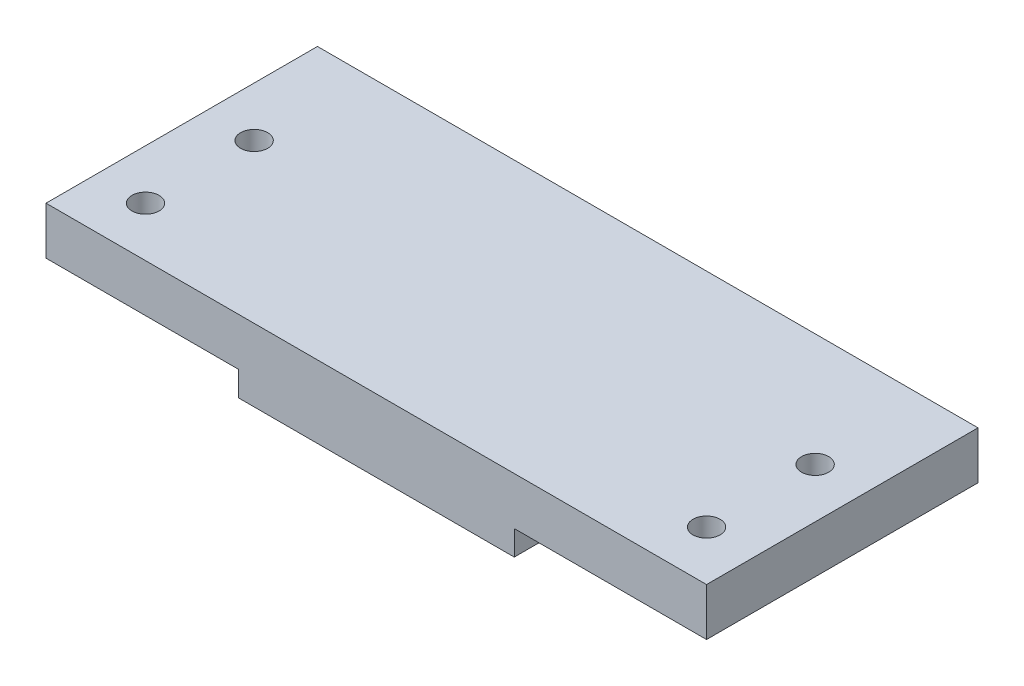
ISO-10303-21;
HEADER;
FILE_DESCRIPTION(('STEP AP214'),'2;1');
FILE_NAME('part.step','',(''),(''),'','','');
FILE_SCHEMA(('AUTOMOTIVE_DESIGN { 1 0 10303 214 1 1 1 1 }'));
ENDSEC;
DATA;
#1=APPLICATION_CONTEXT('core data for automotive mechanical design processes');
#2=APPLICATION_PROTOCOL_DEFINITION('international standard','automotive_design',2000,#1);
#3=PRODUCT_CONTEXT('',#1,'mechanical');
#4=PRODUCT('Part','Part','',(#3));
#5=PRODUCT_RELATED_PRODUCT_CATEGORY('part','',(#4));
#6=PRODUCT_DEFINITION_FORMATION('','',#4);
#7=PRODUCT_DEFINITION_CONTEXT('part definition',#1,'design');
#8=PRODUCT_DEFINITION('design','',#6,#7);
#9=PRODUCT_DEFINITION_SHAPE('','',#8);
#10=(LENGTH_UNIT() NAMED_UNIT(*) SI_UNIT(.MILLI.,.METRE.));
#11=(NAMED_UNIT(*) PLANE_ANGLE_UNIT() SI_UNIT($,.RADIAN.));
#12=(NAMED_UNIT(*) SI_UNIT($,.STERADIAN.) SOLID_ANGLE_UNIT());
#13=UNCERTAINTY_MEASURE_WITH_UNIT(LENGTH_MEASURE(1.E-05),#10,'distance_accuracy_value','');
#14=(GEOMETRIC_REPRESENTATION_CONTEXT(3) GLOBAL_UNCERTAINTY_ASSIGNED_CONTEXT((#13)) GLOBAL_UNIT_ASSIGNED_CONTEXT((#10,
#11,#12)) REPRESENTATION_CONTEXT('',''));
#15=CARTESIAN_POINT('',(0.,0.,0.));
#16=DIRECTION('',(0.,0.,1.));
#17=DIRECTION('',(1.,0.,0.));
#18=AXIS2_PLACEMENT_3D('',#15,#16,#17);
#19=CARTESIAN_POINT('',(36.5,8.,15.));
#20=DIRECTION('',(-1.,0.,0.));
#21=DIRECTION('',(0.,0.,1.));
#22=AXIS2_PLACEMENT_3D('',#19,#20,#21);
#23=PLANE('',#22);
#24=DIRECTION('',(0.,-1.,0.));
#25=VECTOR('',#24,1.);
#26=CARTESIAN_POINT('',(36.5,8.,15.));
#27=LINE('',#26,#25);
#28=CARTESIAN_POINT('',(36.5,8.,15.));
#29=VERTEX_POINT('',#28);
#30=CARTESIAN_POINT('',(36.5,2.73530313856804,15.));
#31=VERTEX_POINT('',#30);
#32=EDGE_CURVE('E156',#29,#31,#27,.T.);
#33=ORIENTED_EDGE('',*,*,#32,.T.);
#34=DIRECTION('',(0.,0.,-1.));
#35=VECTOR('',#34,1.);
#36=CARTESIAN_POINT('',(36.5,2.73530313856804,15.));
#37=LINE('',#36,#35);
#38=CARTESIAN_POINT('',(36.5,2.73530313856804,-15.));
#39=VERTEX_POINT('',#38);
#40=EDGE_CURVE('E105',#31,#39,#37,.T.);
#41=ORIENTED_EDGE('',*,*,#40,.T.);
#42=DIRECTION('',(0.,-1.,0.));
#43=VECTOR('',#42,1.);
#44=CARTESIAN_POINT('',(36.5,8.,-15.));
#45=LINE('',#44,#43);
#46=CARTESIAN_POINT('',(36.5,8.,-15.));
#47=VERTEX_POINT('',#46);
#48=EDGE_CURVE('E11',#47,#39,#45,.T.);
#49=ORIENTED_EDGE('',*,*,#48,.F.);
#50=DIRECTION('',(0.,0.,-1.));
#51=VECTOR('',#50,1.);
#52=CARTESIAN_POINT('',(36.5,8.,15.));
#53=LINE('',#52,#51);
#54=EDGE_CURVE('E147',#29,#47,#53,.T.);
#55=ORIENTED_EDGE('',*,*,#54,.F.);
#56=EDGE_LOOP('',(#33,#41,#49,#55));
#57=FACE_BOUND('',#56,.T.);
#58=ADVANCED_FACE('F34',(#57),#23,.F.);
#59=CARTESIAN_POINT('',(-36.5,8.,-15.));
#60=DIRECTION('',(0.,0.,1.));
#61=DIRECTION('',(1.,0.,0.));
#62=AXIS2_PLACEMENT_3D('',#59,#60,#61);
#63=PLANE('',#62);
#64=ORIENTED_EDGE('',*,*,#48,.T.);
#65=DIRECTION('',(1.,0.,0.));
#66=VECTOR('',#65,1.);
#67=CARTESIAN_POINT('',(36.5,2.73530313856804,-15.));
#68=LINE('',#67,#66);
#69=CARTESIAN_POINT('',(15.25,2.73530313856804,-15.));
#70=VERTEX_POINT('',#69);
#71=EDGE_CURVE('E121',#70,#39,#68,.T.);
#72=ORIENTED_EDGE('',*,*,#71,.F.);
#73=DIRECTION('',(0.,1.,0.));
#74=VECTOR('',#73,1.);
#75=CARTESIAN_POINT('',(15.25,0.,-15.));
#76=LINE('',#75,#74);
#77=CARTESIAN_POINT('',(15.25,0.,-15.));
#78=VERTEX_POINT('',#77);
#79=EDGE_CURVE('E102',#78,#70,#76,.T.);
#80=ORIENTED_EDGE('',*,*,#79,.F.);
#81=DIRECTION('',(-1.,0.,0.));
#82=VECTOR('',#81,1.);
#83=CARTESIAN_POINT('',(-36.5,0.,-15.));
#84=LINE('',#83,#82);
#85=CARTESIAN_POINT('',(-15.25,0.,-15.));
#86=VERTEX_POINT('',#85);
#87=EDGE_CURVE('E130',#78,#86,#84,.T.);
#88=ORIENTED_EDGE('',*,*,#87,.T.);
#89=DIRECTION('',(0.,-1.,0.));
#90=VECTOR('',#89,1.);
#91=CARTESIAN_POINT('',(-15.25,0.,-15.));
#92=LINE('',#91,#90);
#93=CARTESIAN_POINT('',(-15.25,2.73530313856804,-15.));
#94=VERTEX_POINT('',#93);
#95=EDGE_CURVE('E50',#94,#86,#92,.T.);
#96=ORIENTED_EDGE('',*,*,#95,.F.);
#97=DIRECTION('',(1.,0.,0.));
#98=VECTOR('',#97,1.);
#99=CARTESIAN_POINT('',(-36.5,2.73530313856804,-15.));
#100=LINE('',#99,#98);
#101=CARTESIAN_POINT('',(-36.5,2.73530313856804,-15.));
#102=VERTEX_POINT('',#101);
#103=EDGE_CURVE('E139',#102,#94,#100,.T.);
#104=ORIENTED_EDGE('',*,*,#103,.F.);
#105=DIRECTION('',(0.,-1.,0.));
#106=VECTOR('',#105,1.);
#107=CARTESIAN_POINT('',(-36.5,8.,-15.));
#108=LINE('',#107,#106);
#109=CARTESIAN_POINT('',(-36.5,8.,-15.));
#110=VERTEX_POINT('',#109);
#111=EDGE_CURVE('E42',#110,#102,#108,.T.);
#112=ORIENTED_EDGE('',*,*,#111,.F.);
#113=DIRECTION('',(-1.,0.,0.));
#114=VECTOR('',#113,1.);
#115=CARTESIAN_POINT('',(-36.5,8.,-15.));
#116=LINE('',#115,#114);
#117=EDGE_CURVE('E150',#47,#110,#116,.T.);
#118=ORIENTED_EDGE('',*,*,#117,.F.);
#119=EDGE_LOOP('',(#64,#72,#80,#88,#96,#104,#112,#118));
#120=FACE_BOUND('',#119,.T.);
#121=ADVANCED_FACE('F206',(#120),#63,.F.);
#122=CARTESIAN_POINT('',(-36.5,8.,15.));
#123=DIRECTION('',(1.,0.,0.));
#124=DIRECTION('',(0.,0.,-1.));
#125=AXIS2_PLACEMENT_3D('',#122,#123,#124);
#126=PLANE('',#125);
#127=ORIENTED_EDGE('',*,*,#111,.T.);
#128=DIRECTION('',(0.,0.,-1.));
#129=VECTOR('',#128,1.);
#130=CARTESIAN_POINT('',(-36.5,2.73530313856804,15.));
#131=LINE('',#130,#129);
#132=CARTESIAN_POINT('',(-36.5,2.73530313856804,15.));
#133=VERTEX_POINT('',#132);
#134=EDGE_CURVE('E138',#133,#102,#131,.T.);
#135=ORIENTED_EDGE('',*,*,#134,.F.);
#136=DIRECTION('',(0.,-1.,0.));
#137=VECTOR('',#136,1.);
#138=CARTESIAN_POINT('',(-36.5,8.,15.));
#139=LINE('',#138,#137);
#140=CARTESIAN_POINT('',(-36.5,8.,15.));
#141=VERTEX_POINT('',#140);
#142=EDGE_CURVE('E161',#141,#133,#139,.T.);
#143=ORIENTED_EDGE('',*,*,#142,.F.);
#144=DIRECTION('',(0.,0.,1.));
#145=VECTOR('',#144,1.);
#146=CARTESIAN_POINT('',(-36.5,8.,15.));
#147=LINE('',#146,#145);
#148=EDGE_CURVE('E152',#110,#141,#147,.T.);
#149=ORIENTED_EDGE('',*,*,#148,.F.);
#150=EDGE_LOOP('',(#127,#135,#143,#149));
#151=FACE_BOUND('',#150,.T.);
#152=ADVANCED_FACE('F211',(#151),#126,.F.);
#153=CARTESIAN_POINT('',(-36.5,8.,15.));
#154=DIRECTION('',(0.,0.,-1.));
#155=DIRECTION('',(-1.,0.,0.));
#156=AXIS2_PLACEMENT_3D('',#153,#154,#155);
#157=PLANE('',#156);
#158=DIRECTION('',(0.,1.,0.));
#159=VECTOR('',#158,1.);
#160=CARTESIAN_POINT('',(15.25,0.,15.));
#161=LINE('',#160,#159);
#162=CARTESIAN_POINT('',(15.25,0.,15.));
#163=VERTEX_POINT('',#162);
#164=CARTESIAN_POINT('',(15.25,2.73530313856804,15.));
#165=VERTEX_POINT('',#164);
#166=EDGE_CURVE('E58',#163,#165,#161,.T.);
#167=ORIENTED_EDGE('',*,*,#166,.T.);
#168=DIRECTION('',(1.,0.,0.));
#169=VECTOR('',#168,1.);
#170=CARTESIAN_POINT('',(36.5,2.73530313856804,15.));
#171=LINE('',#170,#169);
#172=EDGE_CURVE('E109',#165,#31,#171,.T.);
#173=ORIENTED_EDGE('',*,*,#172,.T.);
#174=ORIENTED_EDGE('',*,*,#32,.F.);
#175=DIRECTION('',(1.,0.,0.));
#176=VECTOR('',#175,1.);
#177=CARTESIAN_POINT('',(-36.5,8.,15.));
#178=LINE('',#177,#176);
#179=EDGE_CURVE('E154',#141,#29,#178,.T.);
#180=ORIENTED_EDGE('',*,*,#179,.F.);
#181=ORIENTED_EDGE('',*,*,#142,.T.);
#182=DIRECTION('',(1.,0.,0.));
#183=VECTOR('',#182,1.);
#184=CARTESIAN_POINT('',(-36.5,2.73530313856804,15.));
#185=LINE('',#184,#183);
#186=CARTESIAN_POINT('',(-15.25,2.73530313856804,15.));
#187=VERTEX_POINT('',#186);
#188=EDGE_CURVE('E133',#133,#187,#185,.T.);
#189=ORIENTED_EDGE('',*,*,#188,.T.);
#190=DIRECTION('',(0.,-1.,0.));
#191=VECTOR('',#190,1.);
#192=CARTESIAN_POINT('',(-15.25,0.,15.));
#193=LINE('',#192,#191);
#194=CARTESIAN_POINT('',(-15.25,0.,15.));
#195=VERTEX_POINT('',#194);
#196=EDGE_CURVE('E136',#187,#195,#193,.T.);
#197=ORIENTED_EDGE('',*,*,#196,.T.);
#198=DIRECTION('',(1.,0.,0.));
#199=VECTOR('',#198,1.);
#200=CARTESIAN_POINT('',(-36.5,0.,15.));
#201=LINE('',#200,#199);
#202=EDGE_CURVE('E120',#195,#163,#201,.T.);
#203=ORIENTED_EDGE('',*,*,#202,.T.);
#204=EDGE_LOOP('',(#167,#173,#174,#180,#181,#189,#197,#203));
#205=FACE_BOUND('',#204,.T.);
#206=ADVANCED_FACE('F117',(#205),#157,.F.);
#207=CARTESIAN_POINT('',(0.,8.,0.));
#208=DIRECTION('',(0.,-1.,0.));
#209=DIRECTION('',(0.,0.,-1.));
#210=AXIS2_PLACEMENT_3D('',#207,#208,#209);
#211=PLANE('',#210);
#212=CARTESIAN_POINT('',(31.,8.,9.49999999999999));
#213=DIRECTION('',(0.,-1.,0.));
#214=DIRECTION('',(0.,0.,-1.));
#215=AXIS2_PLACEMENT_3D('',#212,#213,#214);
#216=CIRCLE('',#215,1.5);
#217=CARTESIAN_POINT('',(32.5,8.,9.49999999999999));
#218=VERTEX_POINT('',#217);
#219=EDGE_CURVE('E172',#218,#218,#216,.T.);
#220=ORIENTED_EDGE('',*,*,#219,.T.);
#221=EDGE_LOOP('',(#220));
#222=FACE_BOUND('',#221,.T.);
#223=CARTESIAN_POINT('',(-31.,8.,9.5));
#224=DIRECTION('',(0.,-1.,0.));
#225=DIRECTION('',(0.,0.,-1.));
#226=AXIS2_PLACEMENT_3D('',#223,#224,#225);
#227=CIRCLE('',#226,1.5);
#228=CARTESIAN_POINT('',(-29.5,8.,9.5));
#229=VERTEX_POINT('',#228);
#230=EDGE_CURVE('E125',#229,#229,#227,.T.);
#231=ORIENTED_EDGE('',*,*,#230,.T.);
#232=EDGE_LOOP('',(#231));
#233=FACE_BOUND('',#232,.T.);
#234=CARTESIAN_POINT('',(-31.,8.,-2.5));
#235=DIRECTION('',(0.,-1.,0.));
#236=DIRECTION('',(0.,0.,-1.));
#237=AXIS2_PLACEMENT_3D('',#234,#235,#236);
#238=CIRCLE('',#237,1.5);
#239=CARTESIAN_POINT('',(-29.5,8.,-2.5));
#240=VERTEX_POINT('',#239);
#241=EDGE_CURVE('E175',#240,#240,#238,.T.);
#242=ORIENTED_EDGE('',*,*,#241,.T.);
#243=EDGE_LOOP('',(#242));
#244=FACE_BOUND('',#243,.T.);
#245=CARTESIAN_POINT('',(31.,8.,-2.50000000000001));
#246=DIRECTION('',(0.,-1.,0.));
#247=DIRECTION('',(0.,0.,-1.));
#248=AXIS2_PLACEMENT_3D('',#245,#246,#247);
#249=CIRCLE('',#248,1.5);
#250=CARTESIAN_POINT('',(32.5,8.,-2.50000000000001));
#251=VERTEX_POINT('',#250);
#252=EDGE_CURVE('E169',#251,#251,#249,.T.);
#253=ORIENTED_EDGE('',*,*,#252,.T.);
#254=EDGE_LOOP('',(#253));
#255=FACE_BOUND('',#254,.T.);
#256=ORIENTED_EDGE('',*,*,#54,.T.);
#257=ORIENTED_EDGE('',*,*,#117,.T.);
#258=ORIENTED_EDGE('',*,*,#148,.T.);
#259=ORIENTED_EDGE('',*,*,#179,.T.);
#260=EDGE_LOOP('',(#256,#257,#258,#259));
#261=FACE_BOUND('',#260,.T.);
#262=ADVANCED_FACE('F187',(#222,#233,#244,#255,#261),#211,.F.);
#263=CARTESIAN_POINT('',(0.,0.,0.));
#264=DIRECTION('',(0.,-1.,0.));
#265=DIRECTION('',(0.,0.,-1.));
#266=AXIS2_PLACEMENT_3D('',#263,#264,#265);
#267=PLANE('',#266);
#268=DIRECTION('',(0.,0.,-1.));
#269=VECTOR('',#268,1.);
#270=CARTESIAN_POINT('',(15.25,0.,15.));
#271=LINE('',#270,#269);
#272=EDGE_CURVE('E106',#163,#78,#271,.T.);
#273=ORIENTED_EDGE('',*,*,#272,.F.);
#274=ORIENTED_EDGE('',*,*,#202,.F.);
#275=DIRECTION('',(0.,0.,-1.));
#276=VECTOR('',#275,1.);
#277=CARTESIAN_POINT('',(-15.25,0.,15.));
#278=LINE('',#277,#276);
#279=EDGE_CURVE('E128',#195,#86,#278,.T.);
#280=ORIENTED_EDGE('',*,*,#279,.T.);
#281=ORIENTED_EDGE('',*,*,#87,.F.);
#282=EDGE_LOOP('',(#273,#274,#280,#281));
#283=FACE_BOUND('',#282,.T.);
#284=ADVANCED_FACE('F226',(#283),#267,.T.);
#285=CARTESIAN_POINT('',(-15.25,0.,15.));
#286=DIRECTION('',(1.,0.,0.));
#287=DIRECTION('',(0.,0.,-1.));
#288=AXIS2_PLACEMENT_3D('',#285,#286,#287);
#289=PLANE('',#288);
#290=ORIENTED_EDGE('',*,*,#95,.T.);
#291=ORIENTED_EDGE('',*,*,#279,.F.);
#292=ORIENTED_EDGE('',*,*,#196,.F.);
#293=DIRECTION('',(0.,0.,-1.));
#294=VECTOR('',#293,1.);
#295=CARTESIAN_POINT('',(-15.25,2.73530313856804,15.));
#296=LINE('',#295,#294);
#297=EDGE_CURVE('E144',#187,#94,#296,.T.);
#298=ORIENTED_EDGE('',*,*,#297,.T.);
#299=EDGE_LOOP('',(#290,#291,#292,#298));
#300=FACE_BOUND('',#299,.T.);
#301=ADVANCED_FACE('F228',(#300),#289,.F.);
#302=CARTESIAN_POINT('',(-36.5,2.73530313856804,15.));
#303=DIRECTION('',(0.,1.,0.));
#304=DIRECTION('',(0.,0.,1.));
#305=AXIS2_PLACEMENT_3D('',#302,#303,#304);
#306=PLANE('',#305);
#307=CARTESIAN_POINT('',(-31.,2.73530313856804,9.5));
#308=DIRECTION('',(0.,1.,0.));
#309=DIRECTION('',(0.,0.,1.));
#310=AXIS2_PLACEMENT_3D('',#307,#308,#309);
#311=CIRCLE('',#310,1.5);
#312=CARTESIAN_POINT('',(-29.5,2.73530313856804,9.5));
#313=VERTEX_POINT('',#312);
#314=EDGE_CURVE('E37',#313,#313,#311,.T.);
#315=ORIENTED_EDGE('',*,*,#314,.T.);
#316=EDGE_LOOP('',(#315));
#317=FACE_BOUND('',#316,.T.);
#318=CARTESIAN_POINT('',(-31.,2.73530313856804,-2.5));
#319=DIRECTION('',(0.,1.,0.));
#320=DIRECTION('',(0.,0.,1.));
#321=AXIS2_PLACEMENT_3D('',#318,#319,#320);
#322=CIRCLE('',#321,1.5);
#323=CARTESIAN_POINT('',(-29.5,2.73530313856804,-2.5));
#324=VERTEX_POINT('',#323);
#325=EDGE_CURVE('E173',#324,#324,#322,.T.);
#326=ORIENTED_EDGE('',*,*,#325,.T.);
#327=EDGE_LOOP('',(#326));
#328=FACE_BOUND('',#327,.T.);
#329=ORIENTED_EDGE('',*,*,#103,.T.);
#330=ORIENTED_EDGE('',*,*,#297,.F.);
#331=ORIENTED_EDGE('',*,*,#188,.F.);
#332=ORIENTED_EDGE('',*,*,#134,.T.);
#333=EDGE_LOOP('',(#329,#330,#331,#332));
#334=FACE_BOUND('',#333,.T.);
#335=ADVANCED_FACE('F223',(#317,#328,#334),#306,.F.);
#336=CARTESIAN_POINT('',(36.5,2.73530313856804,15.));
#337=DIRECTION('',(0.,1.,0.));
#338=DIRECTION('',(0.,0.,1.));
#339=AXIS2_PLACEMENT_3D('',#336,#337,#338);
#340=PLANE('',#339);
#341=CARTESIAN_POINT('',(31.,2.73530313856804,9.49999999999999));
#342=DIRECTION('',(0.,1.,0.));
#343=DIRECTION('',(0.,0.,1.));
#344=AXIS2_PLACEMENT_3D('',#341,#342,#343);
#345=CIRCLE('',#344,1.5);
#346=CARTESIAN_POINT('',(32.5,2.73530313856804,9.49999999999999));
#347=VERTEX_POINT('',#346);
#348=EDGE_CURVE('E170',#347,#347,#345,.T.);
#349=ORIENTED_EDGE('',*,*,#348,.T.);
#350=EDGE_LOOP('',(#349));
#351=FACE_BOUND('',#350,.T.);
#352=CARTESIAN_POINT('',(31.,2.73530313856804,-2.50000000000001));
#353=DIRECTION('',(0.,1.,0.));
#354=DIRECTION('',(0.,0.,1.));
#355=AXIS2_PLACEMENT_3D('',#352,#353,#354);
#356=CIRCLE('',#355,1.5);
#357=CARTESIAN_POINT('',(32.5,2.73530313856804,-2.50000000000001));
#358=VERTEX_POINT('',#357);
#359=EDGE_CURVE('E166',#358,#358,#356,.T.);
#360=ORIENTED_EDGE('',*,*,#359,.T.);
#361=EDGE_LOOP('',(#360));
#362=FACE_BOUND('',#361,.T.);
#363=ORIENTED_EDGE('',*,*,#71,.T.);
#364=ORIENTED_EDGE('',*,*,#40,.F.);
#365=ORIENTED_EDGE('',*,*,#172,.F.);
#366=DIRECTION('',(0.,0.,-1.));
#367=VECTOR('',#366,1.);
#368=CARTESIAN_POINT('',(15.25,2.73530313856804,15.));
#369=LINE('',#368,#367);
#370=EDGE_CURVE('E98',#165,#70,#369,.T.);
#371=ORIENTED_EDGE('',*,*,#370,.T.);
#372=EDGE_LOOP('',(#363,#364,#365,#371));
#373=FACE_BOUND('',#372,.T.);
#374=ADVANCED_FACE('F110',(#351,#362,#373),#340,.F.);
#375=CARTESIAN_POINT('',(15.25,0.,15.));
#376=DIRECTION('',(-1.,0.,0.));
#377=DIRECTION('',(0.,0.,1.));
#378=AXIS2_PLACEMENT_3D('',#375,#376,#377);
#379=PLANE('',#378);
#380=ORIENTED_EDGE('',*,*,#79,.T.);
#381=ORIENTED_EDGE('',*,*,#370,.F.);
#382=ORIENTED_EDGE('',*,*,#166,.F.);
#383=ORIENTED_EDGE('',*,*,#272,.T.);
#384=EDGE_LOOP('',(#380,#381,#382,#383));
#385=FACE_BOUND('',#384,.T.);
#386=ADVANCED_FACE('F100',(#385),#379,.F.);
#387=CARTESIAN_POINT('',(31.,25.,-2.50000000000001));
#388=DIRECTION('',(0.,-1.,0.));
#389=DIRECTION('',(1.,0.,0.));
#390=AXIS2_PLACEMENT_3D('',#387,#388,#389);
#391=CYLINDRICAL_SURFACE('',#390,1.5);
#392=CARTESIAN_POINT('',(32.5,2.73530313856804,-2.50000000000001));
#393=CARTESIAN_POINT('',(32.5,2.79014373087463,-2.50000000000001));
#394=CARTESIAN_POINT('',(32.5,2.84498432318121,-2.50000000000001));
#395=CARTESIAN_POINT('',(32.5,2.95466550779437,-2.50000000000001));
#396=CARTESIAN_POINT('',(32.5,3.00950610010096,-2.50000000000001));
#397=CARTESIAN_POINT('',(32.5,3.11918728471412,-2.50000000000001));
#398=CARTESIAN_POINT('',(32.5,3.17402787702071,-2.50000000000001));
#399=CARTESIAN_POINT('',(32.5,3.28370906163387,-2.50000000000001));
#400=CARTESIAN_POINT('',(32.5,3.33854965394046,-2.50000000000001));
#401=CARTESIAN_POINT('',(32.5,3.44823083855362,-2.50000000000001));
#402=CARTESIAN_POINT('',(32.5,3.50307143086021,-2.50000000000001));
#403=CARTESIAN_POINT('',(32.5,3.61275261547337,-2.50000000000001));
#404=CARTESIAN_POINT('',(32.5,3.66759320777995,-2.50000000000001));
#405=CARTESIAN_POINT('',(32.5,3.77727439239312,-2.50000000000001));
#406=CARTESIAN_POINT('',(32.5,3.8321149846997,-2.50000000000001));
#407=CARTESIAN_POINT('',(32.5,3.94179616931287,-2.50000000000001));
#408=CARTESIAN_POINT('',(32.5,3.99663676161945,-2.50000000000001));
#409=CARTESIAN_POINT('',(32.5,4.10631794623262,-2.50000000000001));
#410=CARTESIAN_POINT('',(32.5,4.1611585385392,-2.50000000000001));
#411=CARTESIAN_POINT('',(32.5,4.27083972315237,-2.50000000000001));
#412=CARTESIAN_POINT('',(32.5,4.32568031545895,-2.50000000000001));
#413=CARTESIAN_POINT('',(32.5,4.43536150007211,-2.50000000000001));
#414=CARTESIAN_POINT('',(32.5,4.4902020923787,-2.50000000000001));
#415=CARTESIAN_POINT('',(32.5,4.59988327699186,-2.50000000000001));
#416=CARTESIAN_POINT('',(32.5,4.65472386929845,-2.50000000000001));
#417=CARTESIAN_POINT('',(32.5,4.76440505391161,-2.50000000000001));
#418=CARTESIAN_POINT('',(32.5,4.8192456462182,-2.50000000000001));
#419=CARTESIAN_POINT('',(32.5,4.92892683083136,-2.50000000000001));
#420=CARTESIAN_POINT('',(32.5,4.98376742313794,-2.50000000000001));
#421=CARTESIAN_POINT('',(32.5,5.09344860775111,-2.50000000000001));
#422=CARTESIAN_POINT('',(32.5,5.14828920005769,-2.50000000000001));
#423=CARTESIAN_POINT('',(32.5,5.25797038467086,-2.50000000000001));
#424=CARTESIAN_POINT('',(32.5,5.31281097697744,-2.50000000000001));
#425=CARTESIAN_POINT('',(32.5,5.42249216159061,-2.50000000000001));
#426=CARTESIAN_POINT('',(32.5,5.47733275389719,-2.50000000000001));
#427=CARTESIAN_POINT('',(32.5,5.58701393851035,-2.50000000000001));
#428=CARTESIAN_POINT('',(32.5,5.64185453081694,-2.50000000000001));
#429=CARTESIAN_POINT('',(32.5,5.7515357154301,-2.50000000000001));
#430=CARTESIAN_POINT('',(32.5,5.80637630773669,-2.50000000000001));
#431=CARTESIAN_POINT('',(32.5,5.91605749234985,-2.50000000000001));
#432=CARTESIAN_POINT('',(32.5,5.97089808465644,-2.50000000000001));
#433=CARTESIAN_POINT('',(32.5,6.0805792692696,-2.50000000000001));
#434=CARTESIAN_POINT('',(32.5,6.13541986157619,-2.50000000000001));
#435=CARTESIAN_POINT('',(32.5,6.24510104618935,-2.50000000000001));
#436=CARTESIAN_POINT('',(32.5,6.29994163849593,-2.50000000000001));
#437=CARTESIAN_POINT('',(32.5,6.4096228231091,-2.50000000000001));
#438=CARTESIAN_POINT('',(32.5,6.46446341541568,-2.50000000000001));
#439=CARTESIAN_POINT('',(32.5,6.57414460002885,-2.50000000000001));
#440=CARTESIAN_POINT('',(32.5,6.62898519233543,-2.50000000000001));
#441=CARTESIAN_POINT('',(32.5,6.7386663769486,-2.50000000000001));
#442=CARTESIAN_POINT('',(32.5,6.79350696925518,-2.50000000000001));
#443=CARTESIAN_POINT('',(32.5,6.90318815386835,-2.50000000000001));
#444=CARTESIAN_POINT('',(32.5,6.95802874617493,-2.50000000000001));
#445=CARTESIAN_POINT('',(32.5,7.06770993078809,-2.50000000000001));
#446=CARTESIAN_POINT('',(32.5,7.12255052309468,-2.50000000000001));
#447=CARTESIAN_POINT('',(32.5,7.23223170770784,-2.50000000000001));
#448=CARTESIAN_POINT('',(32.5,7.28707230001443,-2.50000000000001));
#449=CARTESIAN_POINT('',(32.5,7.39675348462759,-2.50000000000001));
#450=CARTESIAN_POINT('',(32.5,7.45159407693417,-2.50000000000001));
#451=CARTESIAN_POINT('',(32.5,7.56127526154734,-2.50000000000001));
#452=CARTESIAN_POINT('',(32.5,7.61611585385392,-2.50000000000001));
#453=CARTESIAN_POINT('',(32.5,7.72579703846709,-2.50000000000001));
#454=CARTESIAN_POINT('',(32.5,7.78063763077367,-2.50000000000001));
#455=CARTESIAN_POINT('',(32.5,7.89031881538684,-2.50000000000001));
#456=CARTESIAN_POINT('',(32.5,7.94515940769342,-2.50000000000001));
#457=CARTESIAN_POINT('',(32.5,8.,-2.50000000000001));
#458=B_SPLINE_CURVE_WITH_KNOTS('',3,(#392,#393,#394,#395,#396,#397,#398,#399,#400,#401,#402,
#403,#404,#405,#406,#407,#408,#409,#410,#411,#412,#413,#414,#415,#416,#417,#418,#419,#420,#421,
#422,#423,#424,#425,#426,#427,#428,#429,#430,#431,#432,#433,#434,#435,#436,#437,#438,#439,#440,
#441,#442,#443,#444,#445,#446,#447,#448,#449,#450,#451,#452,#453,#454,#455,#456,#457),
.UNSPECIFIED.,.F.,.F.,(4,2,2,2,2,2,2,2,2,2,2,2,2,2,2,2,2,2,2,2,2,2,2,2,2,2,2,2,2,2,2,2,4),(0.,
0.164521776919748,0.329043553839496,0.493565330759248,0.658087107678996,0.822608884598744,
0.987130661518492,1.15165243843824,1.31617421535799,1.48069599227774,1.64521776919749,
1.80973954611724,1.97426132303698,2.13878309995674,2.30330487687648,2.46782665379623,
2.63234843071598,2.79687020763573,2.96139198455548,3.12591376147522,3.29043553839498,
3.45495731531472,3.61947909223447,3.78400086915422,3.94852264607397,4.11304442299372,
4.27756619991347,4.44208797683322,4.60660975375296,4.77113153067271,4.93565330759246,
5.10017508451221,5.26469686143196),.UNSPECIFIED.);
#459=EDGE_CURVE('BSEAM190',#358,#251,#458,.T.);
#460=ORIENTED_EDGE('',*,*,#359,.F.);
#461=ORIENTED_EDGE('',*,*,#252,.F.);
#462=ORIENTED_EDGE('',*,*,#459,.T.);
#463=ORIENTED_EDGE('',*,*,#459,.F.);
#464=EDGE_LOOP('',(#460,#462,#461,#463));
#465=FACE_BOUND('',#464,.T.);
#466=ADVANCED_FACE('F190',(#465),#391,.F.);
#467=CARTESIAN_POINT('',(31.,25.,9.49999999999999));
#468=DIRECTION('',(0.,-1.,0.));
#469=DIRECTION('',(1.,0.,0.));
#470=AXIS2_PLACEMENT_3D('',#467,#468,#469);
#471=CYLINDRICAL_SURFACE('',#470,1.5);
#472=CARTESIAN_POINT('',(32.5,2.73530313856804,9.49999999999999));
#473=CARTESIAN_POINT('',(32.5,2.79014373087463,9.49999999999999));
#474=CARTESIAN_POINT('',(32.5,2.84498432318121,9.49999999999999));
#475=CARTESIAN_POINT('',(32.5,2.95466550779437,9.49999999999999));
#476=CARTESIAN_POINT('',(32.5,3.00950610010096,9.49999999999999));
#477=CARTESIAN_POINT('',(32.5,3.11918728471412,9.49999999999999));
#478=CARTESIAN_POINT('',(32.5,3.17402787702071,9.49999999999999));
#479=CARTESIAN_POINT('',(32.5,3.28370906163387,9.49999999999999));
#480=CARTESIAN_POINT('',(32.5,3.33854965394046,9.49999999999999));
#481=CARTESIAN_POINT('',(32.5,3.44823083855362,9.49999999999999));
#482=CARTESIAN_POINT('',(32.5,3.50307143086021,9.49999999999999));
#483=CARTESIAN_POINT('',(32.5,3.61275261547337,9.49999999999999));
#484=CARTESIAN_POINT('',(32.5,3.66759320777995,9.49999999999999));
#485=CARTESIAN_POINT('',(32.5,3.77727439239312,9.49999999999999));
#486=CARTESIAN_POINT('',(32.5,3.8321149846997,9.49999999999999));
#487=CARTESIAN_POINT('',(32.5,3.94179616931287,9.49999999999999));
#488=CARTESIAN_POINT('',(32.5,3.99663676161945,9.49999999999999));
#489=CARTESIAN_POINT('',(32.5,4.10631794623262,9.49999999999999));
#490=CARTESIAN_POINT('',(32.5,4.1611585385392,9.49999999999999));
#491=CARTESIAN_POINT('',(32.5,4.27083972315237,9.49999999999999));
#492=CARTESIAN_POINT('',(32.5,4.32568031545895,9.49999999999999));
#493=CARTESIAN_POINT('',(32.5,4.43536150007211,9.49999999999999));
#494=CARTESIAN_POINT('',(32.5,4.4902020923787,9.49999999999999));
#495=CARTESIAN_POINT('',(32.5,4.59988327699186,9.49999999999999));
#496=CARTESIAN_POINT('',(32.5,4.65472386929845,9.49999999999999));
#497=CARTESIAN_POINT('',(32.5,4.76440505391161,9.49999999999999));
#498=CARTESIAN_POINT('',(32.5,4.8192456462182,9.49999999999999));
#499=CARTESIAN_POINT('',(32.5,4.92892683083136,9.49999999999999));
#500=CARTESIAN_POINT('',(32.5,4.98376742313794,9.49999999999999));
#501=CARTESIAN_POINT('',(32.5,5.09344860775111,9.49999999999999));
#502=CARTESIAN_POINT('',(32.5,5.14828920005769,9.49999999999999));
#503=CARTESIAN_POINT('',(32.5,5.25797038467086,9.49999999999999));
#504=CARTESIAN_POINT('',(32.5,5.31281097697744,9.49999999999999));
#505=CARTESIAN_POINT('',(32.5,5.42249216159061,9.49999999999999));
#506=CARTESIAN_POINT('',(32.5,5.47733275389719,9.49999999999999));
#507=CARTESIAN_POINT('',(32.5,5.58701393851035,9.49999999999999));
#508=CARTESIAN_POINT('',(32.5,5.64185453081694,9.49999999999999));
#509=CARTESIAN_POINT('',(32.5,5.7515357154301,9.49999999999999));
#510=CARTESIAN_POINT('',(32.5,5.80637630773669,9.49999999999999));
#511=CARTESIAN_POINT('',(32.5,5.91605749234985,9.49999999999999));
#512=CARTESIAN_POINT('',(32.5,5.97089808465644,9.49999999999999));
#513=CARTESIAN_POINT('',(32.5,6.0805792692696,9.49999999999999));
#514=CARTESIAN_POINT('',(32.5,6.13541986157619,9.49999999999999));
#515=CARTESIAN_POINT('',(32.5,6.24510104618935,9.49999999999999));
#516=CARTESIAN_POINT('',(32.5,6.29994163849593,9.49999999999999));
#517=CARTESIAN_POINT('',(32.5,6.4096228231091,9.49999999999999));
#518=CARTESIAN_POINT('',(32.5,6.46446341541568,9.49999999999999));
#519=CARTESIAN_POINT('',(32.5,6.57414460002885,9.49999999999999));
#520=CARTESIAN_POINT('',(32.5,6.62898519233543,9.49999999999999));
#521=CARTESIAN_POINT('',(32.5,6.7386663769486,9.49999999999999));
#522=CARTESIAN_POINT('',(32.5,6.79350696925518,9.49999999999999));
#523=CARTESIAN_POINT('',(32.5,6.90318815386835,9.49999999999999));
#524=CARTESIAN_POINT('',(32.5,6.95802874617493,9.49999999999999));
#525=CARTESIAN_POINT('',(32.5,7.06770993078809,9.49999999999999));
#526=CARTESIAN_POINT('',(32.5,7.12255052309468,9.49999999999999));
#527=CARTESIAN_POINT('',(32.5,7.23223170770784,9.49999999999999));
#528=CARTESIAN_POINT('',(32.5,7.28707230001443,9.49999999999999));
#529=CARTESIAN_POINT('',(32.5,7.39675348462759,9.49999999999999));
#530=CARTESIAN_POINT('',(32.5,7.45159407693417,9.49999999999999));
#531=CARTESIAN_POINT('',(32.5,7.56127526154734,9.49999999999999));
#532=CARTESIAN_POINT('',(32.5,7.61611585385392,9.49999999999999));
#533=CARTESIAN_POINT('',(32.5,7.72579703846709,9.49999999999999));
#534=CARTESIAN_POINT('',(32.5,7.78063763077367,9.49999999999999));
#535=CARTESIAN_POINT('',(32.5,7.89031881538684,9.49999999999999));
#536=CARTESIAN_POINT('',(32.5,7.94515940769342,9.49999999999999));
#537=CARTESIAN_POINT('',(32.5,8.,9.49999999999999));
#538=B_SPLINE_CURVE_WITH_KNOTS('',3,(#472,#473,#474,#475,#476,#477,#478,#479,#480,#481,#482,
#483,#484,#485,#486,#487,#488,#489,#490,#491,#492,#493,#494,#495,#496,#497,#498,#499,#500,#501,
#502,#503,#504,#505,#506,#507,#508,#509,#510,#511,#512,#513,#514,#515,#516,#517,#518,#519,#520,
#521,#522,#523,#524,#525,#526,#527,#528,#529,#530,#531,#532,#533,#534,#535,#536,#537),
.UNSPECIFIED.,.F.,.F.,(4,2,2,2,2,2,2,2,2,2,2,2,2,2,2,2,2,2,2,2,2,2,2,2,2,2,2,2,2,2,2,2,4),(0.,
0.164521776919748,0.329043553839496,0.493565330759248,0.658087107678996,0.822608884598744,
0.987130661518492,1.15165243843824,1.31617421535799,1.48069599227774,1.64521776919749,
1.80973954611724,1.97426132303698,2.13878309995674,2.30330487687648,2.46782665379623,
2.63234843071598,2.79687020763573,2.96139198455548,3.12591376147522,3.29043553839498,
3.45495731531472,3.61947909223447,3.78400086915422,3.94852264607397,4.11304442299372,
4.27756619991347,4.44208797683322,4.60660975375296,4.77113153067271,4.93565330759246,
5.10017508451221,5.26469686143196),.UNSPECIFIED.);
#539=EDGE_CURVE('BSEAM192',#347,#218,#538,.T.);
#540=ORIENTED_EDGE('',*,*,#348,.F.);
#541=ORIENTED_EDGE('',*,*,#219,.F.);
#542=ORIENTED_EDGE('',*,*,#539,.T.);
#543=ORIENTED_EDGE('',*,*,#539,.F.);
#544=EDGE_LOOP('',(#540,#542,#541,#543));
#545=FACE_BOUND('',#544,.T.);
#546=ADVANCED_FACE('F192',(#545),#471,.F.);
#547=CARTESIAN_POINT('',(-31.,25.,-2.5));
#548=DIRECTION('',(0.,-1.,0.));
#549=DIRECTION('',(1.,0.,0.));
#550=AXIS2_PLACEMENT_3D('',#547,#548,#549);
#551=CYLINDRICAL_SURFACE('',#550,1.5);
#552=CARTESIAN_POINT('',(-29.5,2.73530313856804,-2.5));
#553=CARTESIAN_POINT('',(-29.5,2.79014373087463,-2.5));
#554=CARTESIAN_POINT('',(-29.5,2.84498432318121,-2.5));
#555=CARTESIAN_POINT('',(-29.5,2.95466550779437,-2.5));
#556=CARTESIAN_POINT('',(-29.5,3.00950610010096,-2.5));
#557=CARTESIAN_POINT('',(-29.5,3.11918728471412,-2.5));
#558=CARTESIAN_POINT('',(-29.5,3.17402787702071,-2.5));
#559=CARTESIAN_POINT('',(-29.5,3.28370906163387,-2.5));
#560=CARTESIAN_POINT('',(-29.5,3.33854965394046,-2.5));
#561=CARTESIAN_POINT('',(-29.5,3.44823083855362,-2.5));
#562=CARTESIAN_POINT('',(-29.5,3.50307143086021,-2.5));
#563=CARTESIAN_POINT('',(-29.5,3.61275261547337,-2.5));
#564=CARTESIAN_POINT('',(-29.5,3.66759320777995,-2.5));
#565=CARTESIAN_POINT('',(-29.5,3.77727439239312,-2.5));
#566=CARTESIAN_POINT('',(-29.5,3.8321149846997,-2.5));
#567=CARTESIAN_POINT('',(-29.5,3.94179616931287,-2.5));
#568=CARTESIAN_POINT('',(-29.5,3.99663676161945,-2.5));
#569=CARTESIAN_POINT('',(-29.5,4.10631794623262,-2.5));
#570=CARTESIAN_POINT('',(-29.5,4.1611585385392,-2.5));
#571=CARTESIAN_POINT('',(-29.5,4.27083972315237,-2.5));
#572=CARTESIAN_POINT('',(-29.5,4.32568031545895,-2.5));
#573=CARTESIAN_POINT('',(-29.5,4.43536150007211,-2.5));
#574=CARTESIAN_POINT('',(-29.5,4.4902020923787,-2.5));
#575=CARTESIAN_POINT('',(-29.5,4.59988327699186,-2.5));
#576=CARTESIAN_POINT('',(-29.5,4.65472386929845,-2.5));
#577=CARTESIAN_POINT('',(-29.5,4.76440505391161,-2.5));
#578=CARTESIAN_POINT('',(-29.5,4.8192456462182,-2.5));
#579=CARTESIAN_POINT('',(-29.5,4.92892683083136,-2.5));
#580=CARTESIAN_POINT('',(-29.5,4.98376742313794,-2.5));
#581=CARTESIAN_POINT('',(-29.5,5.09344860775111,-2.5));
#582=CARTESIAN_POINT('',(-29.5,5.14828920005769,-2.5));
#583=CARTESIAN_POINT('',(-29.5,5.25797038467086,-2.5));
#584=CARTESIAN_POINT('',(-29.5,5.31281097697744,-2.5));
#585=CARTESIAN_POINT('',(-29.5,5.42249216159061,-2.5));
#586=CARTESIAN_POINT('',(-29.5,5.47733275389719,-2.5));
#587=CARTESIAN_POINT('',(-29.5,5.58701393851035,-2.5));
#588=CARTESIAN_POINT('',(-29.5,5.64185453081694,-2.5));
#589=CARTESIAN_POINT('',(-29.5,5.7515357154301,-2.5));
#590=CARTESIAN_POINT('',(-29.5,5.80637630773669,-2.5));
#591=CARTESIAN_POINT('',(-29.5,5.91605749234985,-2.5));
#592=CARTESIAN_POINT('',(-29.5,5.97089808465644,-2.5));
#593=CARTESIAN_POINT('',(-29.5,6.0805792692696,-2.5));
#594=CARTESIAN_POINT('',(-29.5,6.13541986157619,-2.5));
#595=CARTESIAN_POINT('',(-29.5,6.24510104618935,-2.5));
#596=CARTESIAN_POINT('',(-29.5,6.29994163849593,-2.5));
#597=CARTESIAN_POINT('',(-29.5,6.4096228231091,-2.5));
#598=CARTESIAN_POINT('',(-29.5,6.46446341541568,-2.5));
#599=CARTESIAN_POINT('',(-29.5,6.57414460002885,-2.5));
#600=CARTESIAN_POINT('',(-29.5,6.62898519233543,-2.5));
#601=CARTESIAN_POINT('',(-29.5,6.7386663769486,-2.5));
#602=CARTESIAN_POINT('',(-29.5,6.79350696925518,-2.5));
#603=CARTESIAN_POINT('',(-29.5,6.90318815386835,-2.5));
#604=CARTESIAN_POINT('',(-29.5,6.95802874617493,-2.5));
#605=CARTESIAN_POINT('',(-29.5,7.06770993078809,-2.5));
#606=CARTESIAN_POINT('',(-29.5,7.12255052309468,-2.5));
#607=CARTESIAN_POINT('',(-29.5,7.23223170770784,-2.5));
#608=CARTESIAN_POINT('',(-29.5,7.28707230001443,-2.5));
#609=CARTESIAN_POINT('',(-29.5,7.39675348462759,-2.5));
#610=CARTESIAN_POINT('',(-29.5,7.45159407693417,-2.5));
#611=CARTESIAN_POINT('',(-29.5,7.56127526154734,-2.5));
#612=CARTESIAN_POINT('',(-29.5,7.61611585385392,-2.5));
#613=CARTESIAN_POINT('',(-29.5,7.72579703846709,-2.5));
#614=CARTESIAN_POINT('',(-29.5,7.78063763077367,-2.5));
#615=CARTESIAN_POINT('',(-29.5,7.89031881538684,-2.5));
#616=CARTESIAN_POINT('',(-29.5,7.94515940769342,-2.5));
#617=CARTESIAN_POINT('',(-29.5,8.,-2.5));
#618=B_SPLINE_CURVE_WITH_KNOTS('',3,(#552,#553,#554,#555,#556,#557,#558,#559,#560,#561,#562,
#563,#564,#565,#566,#567,#568,#569,#570,#571,#572,#573,#574,#575,#576,#577,#578,#579,#580,#581,
#582,#583,#584,#585,#586,#587,#588,#589,#590,#591,#592,#593,#594,#595,#596,#597,#598,#599,#600,
#601,#602,#603,#604,#605,#606,#607,#608,#609,#610,#611,#612,#613,#614,#615,#616,#617),
.UNSPECIFIED.,.F.,.F.,(4,2,2,2,2,2,2,2,2,2,2,2,2,2,2,2,2,2,2,2,2,2,2,2,2,2,2,2,2,2,2,2,4),(0.,
0.164521776919748,0.329043553839496,0.493565330759248,0.658087107678996,0.822608884598744,
0.987130661518492,1.15165243843824,1.31617421535799,1.48069599227774,1.64521776919749,
1.80973954611724,1.97426132303698,2.13878309995674,2.30330487687648,2.46782665379623,
2.63234843071598,2.79687020763573,2.96139198455548,3.12591376147522,3.29043553839498,
3.45495731531472,3.61947909223447,3.78400086915422,3.94852264607397,4.11304442299372,
4.27756619991347,4.44208797683322,4.60660975375296,4.77113153067271,4.93565330759246,
5.10017508451221,5.26469686143196),.UNSPECIFIED.);
#619=EDGE_CURVE('BSEAM199',#324,#240,#618,.T.);
#620=ORIENTED_EDGE('',*,*,#325,.F.);
#621=ORIENTED_EDGE('',*,*,#241,.F.);
#622=ORIENTED_EDGE('',*,*,#619,.T.);
#623=ORIENTED_EDGE('',*,*,#619,.F.);
#624=EDGE_LOOP('',(#620,#622,#621,#623));
#625=FACE_BOUND('',#624,.T.);
#626=ADVANCED_FACE('F199',(#625),#551,.F.);
#627=CARTESIAN_POINT('',(-31.,25.,9.5));
#628=DIRECTION('',(0.,-1.,0.));
#629=DIRECTION('',(1.,0.,0.));
#630=AXIS2_PLACEMENT_3D('',#627,#628,#629);
#631=CYLINDRICAL_SURFACE('',#630,1.5);
#632=CARTESIAN_POINT('',(-29.5,2.73530313856804,9.5));
#633=CARTESIAN_POINT('',(-29.5,2.79014373087463,9.5));
#634=CARTESIAN_POINT('',(-29.5,2.84498432318121,9.5));
#635=CARTESIAN_POINT('',(-29.5,2.95466550779437,9.5));
#636=CARTESIAN_POINT('',(-29.5,3.00950610010096,9.5));
#637=CARTESIAN_POINT('',(-29.5,3.11918728471412,9.5));
#638=CARTESIAN_POINT('',(-29.5,3.17402787702071,9.5));
#639=CARTESIAN_POINT('',(-29.5,3.28370906163387,9.5));
#640=CARTESIAN_POINT('',(-29.5,3.33854965394046,9.5));
#641=CARTESIAN_POINT('',(-29.5,3.44823083855362,9.5));
#642=CARTESIAN_POINT('',(-29.5,3.50307143086021,9.5));
#643=CARTESIAN_POINT('',(-29.5,3.61275261547337,9.5));
#644=CARTESIAN_POINT('',(-29.5,3.66759320777995,9.5));
#645=CARTESIAN_POINT('',(-29.5,3.77727439239312,9.5));
#646=CARTESIAN_POINT('',(-29.5,3.8321149846997,9.5));
#647=CARTESIAN_POINT('',(-29.5,3.94179616931287,9.5));
#648=CARTESIAN_POINT('',(-29.5,3.99663676161945,9.5));
#649=CARTESIAN_POINT('',(-29.5,4.10631794623262,9.5));
#650=CARTESIAN_POINT('',(-29.5,4.1611585385392,9.5));
#651=CARTESIAN_POINT('',(-29.5,4.27083972315237,9.5));
#652=CARTESIAN_POINT('',(-29.5,4.32568031545895,9.5));
#653=CARTESIAN_POINT('',(-29.5,4.43536150007211,9.5));
#654=CARTESIAN_POINT('',(-29.5,4.4902020923787,9.5));
#655=CARTESIAN_POINT('',(-29.5,4.59988327699186,9.5));
#656=CARTESIAN_POINT('',(-29.5,4.65472386929845,9.5));
#657=CARTESIAN_POINT('',(-29.5,4.76440505391161,9.5));
#658=CARTESIAN_POINT('',(-29.5,4.8192456462182,9.5));
#659=CARTESIAN_POINT('',(-29.5,4.92892683083136,9.5));
#660=CARTESIAN_POINT('',(-29.5,4.98376742313794,9.5));
#661=CARTESIAN_POINT('',(-29.5,5.09344860775111,9.5));
#662=CARTESIAN_POINT('',(-29.5,5.14828920005769,9.5));
#663=CARTESIAN_POINT('',(-29.5,5.25797038467086,9.5));
#664=CARTESIAN_POINT('',(-29.5,5.31281097697744,9.5));
#665=CARTESIAN_POINT('',(-29.5,5.42249216159061,9.5));
#666=CARTESIAN_POINT('',(-29.5,5.47733275389719,9.5));
#667=CARTESIAN_POINT('',(-29.5,5.58701393851035,9.5));
#668=CARTESIAN_POINT('',(-29.5,5.64185453081694,9.5));
#669=CARTESIAN_POINT('',(-29.5,5.7515357154301,9.5));
#670=CARTESIAN_POINT('',(-29.5,5.80637630773669,9.5));
#671=CARTESIAN_POINT('',(-29.5,5.91605749234985,9.5));
#672=CARTESIAN_POINT('',(-29.5,5.97089808465644,9.5));
#673=CARTESIAN_POINT('',(-29.5,6.0805792692696,9.5));
#674=CARTESIAN_POINT('',(-29.5,6.13541986157619,9.5));
#675=CARTESIAN_POINT('',(-29.5,6.24510104618935,9.5));
#676=CARTESIAN_POINT('',(-29.5,6.29994163849593,9.5));
#677=CARTESIAN_POINT('',(-29.5,6.4096228231091,9.5));
#678=CARTESIAN_POINT('',(-29.5,6.46446341541568,9.5));
#679=CARTESIAN_POINT('',(-29.5,6.57414460002885,9.5));
#680=CARTESIAN_POINT('',(-29.5,6.62898519233543,9.5));
#681=CARTESIAN_POINT('',(-29.5,6.7386663769486,9.5));
#682=CARTESIAN_POINT('',(-29.5,6.79350696925518,9.5));
#683=CARTESIAN_POINT('',(-29.5,6.90318815386835,9.5));
#684=CARTESIAN_POINT('',(-29.5,6.95802874617493,9.5));
#685=CARTESIAN_POINT('',(-29.5,7.06770993078809,9.5));
#686=CARTESIAN_POINT('',(-29.5,7.12255052309468,9.5));
#687=CARTESIAN_POINT('',(-29.5,7.23223170770784,9.5));
#688=CARTESIAN_POINT('',(-29.5,7.28707230001443,9.5));
#689=CARTESIAN_POINT('',(-29.5,7.39675348462759,9.5));
#690=CARTESIAN_POINT('',(-29.5,7.45159407693417,9.5));
#691=CARTESIAN_POINT('',(-29.5,7.56127526154734,9.5));
#692=CARTESIAN_POINT('',(-29.5,7.61611585385392,9.5));
#693=CARTESIAN_POINT('',(-29.5,7.72579703846709,9.5));
#694=CARTESIAN_POINT('',(-29.5,7.78063763077367,9.5));
#695=CARTESIAN_POINT('',(-29.5,7.89031881538684,9.5));
#696=CARTESIAN_POINT('',(-29.5,7.94515940769342,9.5));
#697=CARTESIAN_POINT('',(-29.5,8.,9.5));
#698=B_SPLINE_CURVE_WITH_KNOTS('',3,(#632,#633,#634,#635,#636,#637,#638,#639,#640,#641,#642,
#643,#644,#645,#646,#647,#648,#649,#650,#651,#652,#653,#654,#655,#656,#657,#658,#659,#660,#661,
#662,#663,#664,#665,#666,#667,#668,#669,#670,#671,#672,#673,#674,#675,#676,#677,#678,#679,#680,
#681,#682,#683,#684,#685,#686,#687,#688,#689,#690,#691,#692,#693,#694,#695,#696,#697),
.UNSPECIFIED.,.F.,.F.,(4,2,2,2,2,2,2,2,2,2,2,2,2,2,2,2,2,2,2,2,2,2,2,2,2,2,2,2,2,2,2,2,4),(0.,
0.164521776919748,0.329043553839496,0.493565330759248,0.658087107678996,0.822608884598744,
0.987130661518492,1.15165243843824,1.31617421535799,1.48069599227774,1.64521776919749,
1.80973954611724,1.97426132303698,2.13878309995674,2.30330487687648,2.46782665379623,
2.63234843071598,2.79687020763573,2.96139198455548,3.12591376147522,3.29043553839498,
3.45495731531472,3.61947909223447,3.78400086915422,3.94852264607397,4.11304442299372,
4.27756619991347,4.44208797683322,4.60660975375296,4.77113153067271,4.93565330759246,
5.10017508451221,5.26469686143196),.UNSPECIFIED.);
#699=EDGE_CURVE('BSEAM303',#313,#229,#698,.T.);
#700=ORIENTED_EDGE('',*,*,#314,.F.);
#701=ORIENTED_EDGE('',*,*,#230,.F.);
#702=ORIENTED_EDGE('',*,*,#699,.T.);
#703=ORIENTED_EDGE('',*,*,#699,.F.);
#704=EDGE_LOOP('',(#700,#702,#701,#703));
#705=FACE_BOUND('',#704,.T.);
#706=ADVANCED_FACE('F303',(#705),#631,.F.);
#707=CLOSED_SHELL('',(#58,#121,#152,#206,#262,#284,#301,#335,#374,#386,#466,#546,#626,#706));
#708=MANIFOLD_SOLID_BREP('B2',#707);
#709=ADVANCED_BREP_SHAPE_REPRESENTATION('',(#18,#708),#14);
#710=SHAPE_DEFINITION_REPRESENTATION(#9,#709);
ENDSEC;
END-ISO-10303-21;
